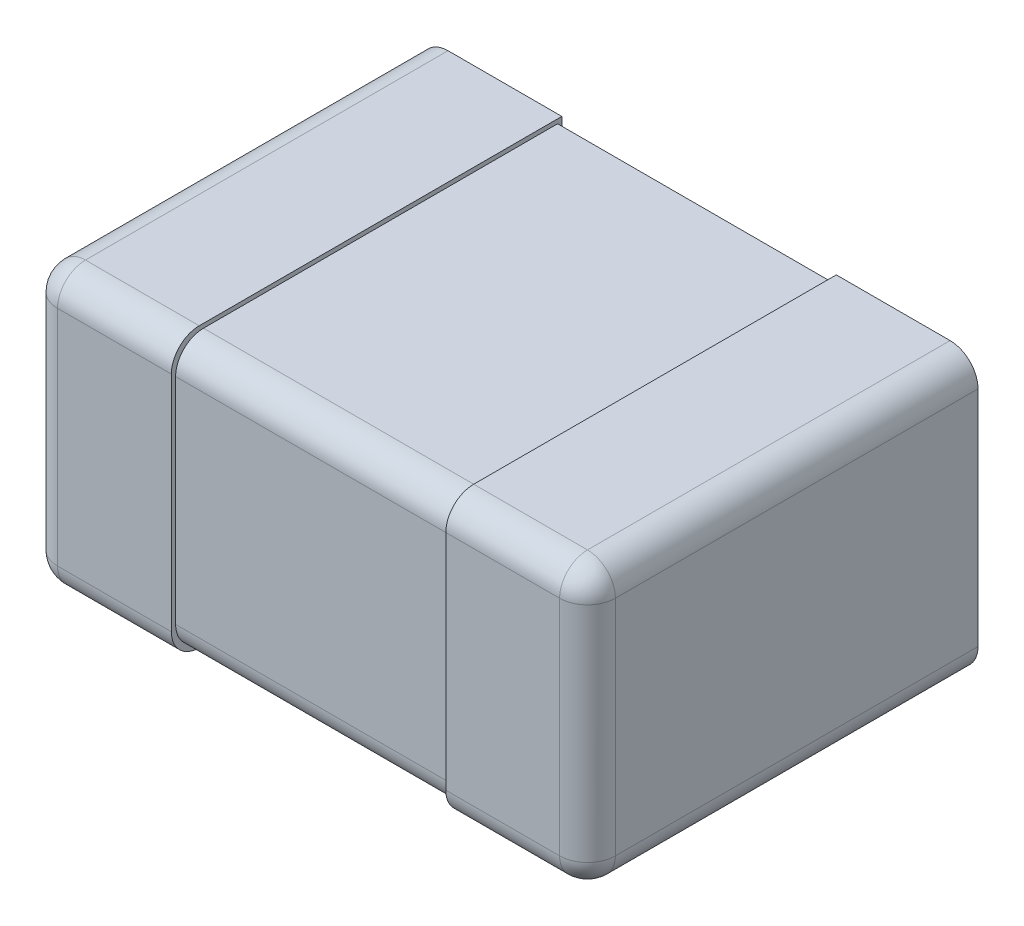
ISO-10303-21;
HEADER;
FILE_DESCRIPTION(('STEP AP214'),'2;1');
FILE_NAME('part.step','',(''),(''),'','','');
FILE_SCHEMA(('AUTOMOTIVE_DESIGN { 1 0 10303 214 1 1 1 1 }'));
ENDSEC;
DATA;
#1=APPLICATION_CONTEXT('core data for automotive mechanical design processes');
#2=APPLICATION_PROTOCOL_DEFINITION('international standard','automotive_design',2000,#1);
#3=PRODUCT_CONTEXT('',#1,'mechanical');
#4=PRODUCT('Part','Part','',(#3));
#5=PRODUCT_RELATED_PRODUCT_CATEGORY('part','',(#4));
#6=PRODUCT_DEFINITION_FORMATION('','',#4);
#7=PRODUCT_DEFINITION_CONTEXT('part definition',#1,'design');
#8=PRODUCT_DEFINITION('design','',#6,#7);
#9=PRODUCT_DEFINITION_SHAPE('','',#8);
#10=(LENGTH_UNIT() NAMED_UNIT(*) SI_UNIT(.MILLI.,.METRE.));
#11=(NAMED_UNIT(*) PLANE_ANGLE_UNIT() SI_UNIT($,.RADIAN.));
#12=(NAMED_UNIT(*) SI_UNIT($,.STERADIAN.) SOLID_ANGLE_UNIT());
#13=UNCERTAINTY_MEASURE_WITH_UNIT(LENGTH_MEASURE(1.E-05),#10,'distance_accuracy_value','');
#14=(GEOMETRIC_REPRESENTATION_CONTEXT(3) GLOBAL_UNCERTAINTY_ASSIGNED_CONTEXT((#13)) GLOBAL_UNIT_ASSIGNED_CONTEXT((#10,
#11,#12)) REPRESENTATION_CONTEXT('',''));
#15=CARTESIAN_POINT('',(0.,0.,0.));
#16=DIRECTION('',(0.,0.,1.));
#17=DIRECTION('',(1.,0.,0.));
#18=AXIS2_PLACEMENT_3D('',#15,#16,#17);
#19=CARTESIAN_POINT('',(-0.45,0.2,0.7262));
#20=DIRECTION('',(-0.707106781186548,0.,0.707106781186548));
#21=DIRECTION('',(0.,1.,0.));
#22=AXIS2_PLACEMENT_3D('',#19,#20,#21);
#23=SPHERICAL_SURFACE('',#22,0.05);
#24=CARTESIAN_POINT('',(-0.45,0.2,0.7262));
#25=DIRECTION('',(-1.,0.,0.));
#26=DIRECTION('',(0.,0.,1.));
#27=AXIS2_PLACEMENT_3D('',#24,#25,#26);
#28=CIRCLE('',#27,0.05);
#29=CARTESIAN_POINT('',(-0.45,0.25,0.7262));
#30=VERTEX_POINT('',#29);
#31=CARTESIAN_POINT('',(-0.45,0.2,0.7762));
#32=VERTEX_POINT('',#31);
#33=EDGE_CURVE('E58',#30,#32,#28,.F.);
#34=ORIENTED_EDGE('',*,*,#33,.F.);
#35=CARTESIAN_POINT('',(-0.45,0.2,0.7262));
#36=DIRECTION('',(0.,0.,-1.));
#37=DIRECTION('',(-1.,0.,0.));
#38=AXIS2_PLACEMENT_3D('',#35,#36,#37);
#39=CIRCLE('',#38,0.05);
#40=CARTESIAN_POINT('',(-0.5,0.2,0.7262));
#41=VERTEX_POINT('',#40);
#42=EDGE_CURVE('E21',#41,#30,#39,.T.);
#43=ORIENTED_EDGE('',*,*,#42,.F.);
#44=CARTESIAN_POINT('',(-0.45,0.2,0.7262));
#45=DIRECTION('',(0.,-1.,0.));
#46=DIRECTION('',(0.,0.,-1.));
#47=AXIS2_PLACEMENT_3D('',#44,#45,#46);
#48=CIRCLE('',#47,0.05);
#49=CARTESIAN_POINT('',(-0.485355339059327,0.2,0.761555339059327));
#50=VERTEX_POINT('',#49);
#51=EDGE_CURVE('E56',#50,#41,#48,.T.);
#52=ORIENTED_EDGE('',*,*,#51,.F.);
#53=CARTESIAN_POINT('',(-0.45,0.2,0.7262));
#54=DIRECTION('',(0.,-1.,0.));
#55=DIRECTION('',(0.,0.,-1.));
#56=AXIS2_PLACEMENT_3D('',#53,#54,#55);
#57=CIRCLE('',#56,0.05);
#58=EDGE_CURVE('E36',#32,#50,#57,.T.);
#59=ORIENTED_EDGE('',*,*,#58,.F.);
#60=EDGE_LOOP('',(#34,#43,#52,#59));
#61=FACE_BOUND('',#60,.T.);
#62=ADVANCED_FACE('F17',(#61),#23,.T.);
#63=CARTESIAN_POINT('',(-0.45,0.2,0.7785103169739));
#64=DIRECTION('',(0.,0.,-1.));
#65=DIRECTION('',(-1.,0.,0.));
#66=AXIS2_PLACEMENT_3D('',#63,#64,#65);
#67=CYLINDRICAL_SURFACE('',#66,0.05);
#68=ORIENTED_EDGE('',*,*,#42,.T.);
#69=DIRECTION('',(0.,0.,1.));
#70=VECTOR('',#69,1.);
#71=CARTESIAN_POINT('',(-0.45,0.25,0.0762));
#72=LINE('',#71,#70);
#73=CARTESIAN_POINT('',(-0.45,0.25,0.0762));
#74=VERTEX_POINT('',#73);
#75=EDGE_CURVE('E160',#74,#30,#72,.T.);
#76=ORIENTED_EDGE('',*,*,#75,.F.);
#77=CARTESIAN_POINT('',(-0.45,0.2,0.0762));
#78=DIRECTION('',(0.,0.,-1.));
#79=DIRECTION('',(-1.,0.,0.));
#80=AXIS2_PLACEMENT_3D('',#77,#78,#79);
#81=CIRCLE('',#80,0.05);
#82=CARTESIAN_POINT('',(-0.5,0.2,0.0762));
#83=VERTEX_POINT('',#82);
#84=EDGE_CURVE('E77',#74,#83,#81,.F.);
#85=ORIENTED_EDGE('',*,*,#84,.T.);
#86=DIRECTION('',(0.,0.,1.));
#87=VECTOR('',#86,1.);
#88=CARTESIAN_POINT('',(-0.5,0.2,0.0762));
#89=LINE('',#88,#87);
#90=EDGE_CURVE('E64',#41,#83,#89,.F.);
#91=ORIENTED_EDGE('',*,*,#90,.F.);
#92=EDGE_LOOP('',(#68,#76,#85,#91));
#93=FACE_BOUND('',#92,.T.);
#94=ADVANCED_FACE('F74',(#93),#67,.T.);
#95=CARTESIAN_POINT('',(-0.5,0.25,0.0762));
#96=DIRECTION('',(-1.,0.,0.));
#97=DIRECTION('',(0.,0.,1.));
#98=AXIS2_PLACEMENT_3D('',#95,#96,#97);
#99=PLANE('',#98);
#100=DIRECTION('',(0.,1.,0.));
#101=VECTOR('',#100,1.);
#102=CARTESIAN_POINT('',(-0.5,0.,0.0762));
#103=LINE('',#102,#101);
#104=CARTESIAN_POINT('',(-0.5,-0.2,0.0762));
#105=VERTEX_POINT('',#104);
#106=EDGE_CURVE('E153',#83,#105,#103,.F.);
#107=ORIENTED_EDGE('',*,*,#106,.T.);
#108=DIRECTION('',(0.,0.,-1.));
#109=VECTOR('',#108,1.);
#110=CARTESIAN_POINT('',(-0.5,-0.2,0.7785103169739));
#111=LINE('',#110,#109);
#112=CARTESIAN_POINT('',(-0.5,-0.2,0.7262));
#113=VERTEX_POINT('',#112);
#114=EDGE_CURVE('E81',#113,#105,#111,.T.);
#115=ORIENTED_EDGE('',*,*,#114,.F.);
#116=DIRECTION('',(0.,-1.,0.));
#117=VECTOR('',#116,1.);
#118=CARTESIAN_POINT('',(-0.5,0.2522702762042,0.7262));
#119=LINE('',#118,#117);
#120=EDGE_CURVE('E69',#41,#113,#119,.T.);
#121=ORIENTED_EDGE('',*,*,#120,.F.);
#122=ORIENTED_EDGE('',*,*,#90,.T.);
#123=EDGE_LOOP('',(#107,#115,#121,#122));
#124=FACE_BOUND('',#123,.T.);
#125=ADVANCED_FACE('F83',(#124),#99,.T.);
#126=CARTESIAN_POINT('',(-0.45,-0.2,0.7785103169739));
#127=DIRECTION('',(0.,0.,-1.));
#128=DIRECTION('',(-1.,0.,0.));
#129=AXIS2_PLACEMENT_3D('',#126,#127,#128);
#130=CYLINDRICAL_SURFACE('',#129,0.05);
#131=CARTESIAN_POINT('',(-0.45,-0.2,0.7262));
#132=DIRECTION('',(0.,0.,-1.));
#133=DIRECTION('',(-1.,0.,0.));
#134=AXIS2_PLACEMENT_3D('',#131,#132,#133);
#135=CIRCLE('',#134,0.05);
#136=CARTESIAN_POINT('',(-0.485355339059327,-0.235355339059327,0.7262));
#137=VERTEX_POINT('',#136);
#138=EDGE_CURVE('E174',#113,#137,#135,.F.);
#139=ORIENTED_EDGE('',*,*,#138,.F.);
#140=ORIENTED_EDGE('',*,*,#114,.T.);
#141=CARTESIAN_POINT('',(-0.45,-0.2,0.0762));
#142=DIRECTION('',(0.,0.,-1.));
#143=DIRECTION('',(-1.,0.,0.));
#144=AXIS2_PLACEMENT_3D('',#141,#142,#143);
#145=CIRCLE('',#144,0.05);
#146=CARTESIAN_POINT('',(-0.45,-0.25,0.0762));
#147=VERTEX_POINT('',#146);
#148=EDGE_CURVE('E155',#105,#147,#145,.F.);
#149=ORIENTED_EDGE('',*,*,#148,.T.);
#150=DIRECTION('',(0.,0.,-1.));
#151=VECTOR('',#150,1.);
#152=CARTESIAN_POINT('',(-0.45,-0.25,0.0762));
#153=LINE('',#152,#151);
#154=CARTESIAN_POINT('',(-0.45,-0.25,0.726200000000002));
#155=VERTEX_POINT('',#154);
#156=EDGE_CURVE('E190',#155,#147,#153,.T.);
#157=ORIENTED_EDGE('',*,*,#156,.F.);
#158=CARTESIAN_POINT('',(-0.45,-0.2,0.7262));
#159=DIRECTION('',(0.,0.,1.));
#160=DIRECTION('',(-0.707106781186547,-0.707106781186547,0.));
#161=AXIS2_PLACEMENT_3D('',#158,#159,#160);
#162=CIRCLE('',#161,0.05);
#163=EDGE_CURVE('E175',#137,#155,#162,.T.);
#164=ORIENTED_EDGE('',*,*,#163,.F.);
#165=EDGE_LOOP('',(#139,#140,#149,#157,#164));
#166=FACE_BOUND('',#165,.T.);
#167=ADVANCED_FACE('F197',(#166),#130,.T.);
#168=CARTESIAN_POINT('',(-0.45,-0.2,0.7262));
#169=DIRECTION('',(-0.707106781186548,-0.707106781186548,0.));
#170=DIRECTION('',(0.,0.,1.));
#171=AXIS2_PLACEMENT_3D('',#168,#169,#170);
#172=SPHERICAL_SURFACE('',#171,0.05);
#173=CARTESIAN_POINT('',(-0.45,-0.2,0.7262));
#174=DIRECTION('',(1.,0.,0.));
#175=DIRECTION('',(0.,0.,-1.));
#176=AXIS2_PLACEMENT_3D('',#173,#174,#175);
#177=CIRCLE('',#176,0.05);
#178=CARTESIAN_POINT('',(-0.45,-0.2,0.7762));
#179=VERTEX_POINT('',#178);
#180=EDGE_CURVE('E147',#179,#155,#177,.T.);
#181=ORIENTED_EDGE('',*,*,#180,.F.);
#182=CARTESIAN_POINT('',(-0.45,-0.2,0.7262));
#183=DIRECTION('',(0.,-1.,0.));
#184=DIRECTION('',(0.,0.,-1.));
#185=AXIS2_PLACEMENT_3D('',#182,#183,#184);
#186=CIRCLE('',#185,0.05);
#187=EDGE_CURVE('E85',#113,#179,#186,.F.);
#188=ORIENTED_EDGE('',*,*,#187,.F.);
#189=ORIENTED_EDGE('',*,*,#138,.T.);
#190=ORIENTED_EDGE('',*,*,#163,.T.);
#191=EDGE_LOOP('',(#181,#188,#189,#190));
#192=FACE_BOUND('',#191,.T.);
#193=ADVANCED_FACE('F193',(#192),#172,.T.);
#194=CARTESIAN_POINT('',(-0.45,0.2522702762042,0.7262));
#195=DIRECTION('',(0.,-1.,0.));
#196=DIRECTION('',(0.,0.,-1.));
#197=AXIS2_PLACEMENT_3D('',#194,#195,#196);
#198=CYLINDRICAL_SURFACE('',#197,0.05);
#199=ORIENTED_EDGE('',*,*,#187,.T.);
#200=DIRECTION('',(0.,1.,0.));
#201=VECTOR('',#200,1.);
#202=CARTESIAN_POINT('',(-0.45,0.,0.7762));
#203=LINE('',#202,#201);
#204=EDGE_CURVE('E317',#32,#179,#203,.F.);
#205=ORIENTED_EDGE('',*,*,#204,.F.);
#206=ORIENTED_EDGE('',*,*,#58,.T.);
#207=ORIENTED_EDGE('',*,*,#51,.T.);
#208=ORIENTED_EDGE('',*,*,#120,.T.);
#209=EDGE_LOOP('',(#199,#205,#206,#207,#208));
#210=FACE_BOUND('',#209,.T.);
#211=ADVANCED_FACE('F67',(#210),#198,.T.);
#212=CARTESIAN_POINT('',(0.45,0.2,0.7262));
#213=DIRECTION('',(0.,0.707106781186548,0.707106781186548));
#214=DIRECTION('',(1.,0.,0.));
#215=AXIS2_PLACEMENT_3D('',#212,#213,#214);
#216=SPHERICAL_SURFACE('',#215,0.05);
#217=CARTESIAN_POINT('',(0.45,0.2,0.7262));
#218=DIRECTION('',(-1.,0.,0.));
#219=DIRECTION('',(0.,0.,1.));
#220=AXIS2_PLACEMENT_3D('',#217,#218,#219);
#221=CIRCLE('',#220,0.05);
#222=CARTESIAN_POINT('',(0.45,0.2,0.7762));
#223=VERTEX_POINT('',#222);
#224=CARTESIAN_POINT('',(0.45,0.235355339059327,0.761555339059327));
#225=VERTEX_POINT('',#224);
#226=EDGE_CURVE('E146',#223,#225,#221,.T.);
#227=ORIENTED_EDGE('',*,*,#226,.F.);
#228=CARTESIAN_POINT('',(0.45,0.2,0.7262));
#229=DIRECTION('',(0.,1.,0.));
#230=DIRECTION('',(0.,0.,1.));
#231=AXIS2_PLACEMENT_3D('',#228,#229,#230);
#232=CIRCLE('',#231,0.05);
#233=CARTESIAN_POINT('',(0.5,0.2,0.7262));
#234=VERTEX_POINT('',#233);
#235=EDGE_CURVE('E87',#234,#223,#232,.F.);
#236=ORIENTED_EDGE('',*,*,#235,.F.);
#237=CARTESIAN_POINT('',(0.45,0.2,0.7262));
#238=DIRECTION('',(0.,0.,-1.));
#239=DIRECTION('',(-1.,0.,0.));
#240=AXIS2_PLACEMENT_3D('',#237,#238,#239);
#241=CIRCLE('',#240,0.05);
#242=CARTESIAN_POINT('',(0.45,0.25,0.7262));
#243=VERTEX_POINT('',#242);
#244=EDGE_CURVE('E162',#243,#234,#241,.T.);
#245=ORIENTED_EDGE('',*,*,#244,.F.);
#246=CARTESIAN_POINT('',(0.45,0.2,0.7262));
#247=DIRECTION('',(-1.,0.,0.));
#248=DIRECTION('',(0.,0.,1.));
#249=AXIS2_PLACEMENT_3D('',#246,#247,#248);
#250=CIRCLE('',#249,0.05);
#251=EDGE_CURVE('E142',#225,#243,#250,.T.);
#252=ORIENTED_EDGE('',*,*,#251,.F.);
#253=EDGE_LOOP('',(#227,#236,#245,#252));
#254=FACE_BOUND('',#253,.T.);
#255=ADVANCED_FACE('F318',(#254),#216,.T.);
#256=CARTESIAN_POINT('',(0.45,-0.2522265148321,0.7262));
#257=DIRECTION('',(0.,1.,0.));
#258=DIRECTION('',(0.,0.,1.));
#259=AXIS2_PLACEMENT_3D('',#256,#257,#258);
#260=CYLINDRICAL_SURFACE('',#259,0.05);
#261=CARTESIAN_POINT('',(0.45,-0.2,0.7262));
#262=DIRECTION('',(0.,1.,0.));
#263=DIRECTION('',(0.,0.,1.));
#264=AXIS2_PLACEMENT_3D('',#261,#262,#263);
#265=CIRCLE('',#264,0.05);
#266=CARTESIAN_POINT('',(0.5,-0.2,0.7262));
#267=VERTEX_POINT('',#266);
#268=CARTESIAN_POINT('',(0.485355339059327,-0.2,0.761555339059327));
#269=VERTEX_POINT('',#268);
#270=EDGE_CURVE('E170',#267,#269,#265,.F.);
#271=ORIENTED_EDGE('',*,*,#270,.F.);
#272=DIRECTION('',(0.,1.,0.));
#273=VECTOR('',#272,1.);
#274=CARTESIAN_POINT('',(0.5,-0.25,0.7262));
#275=LINE('',#274,#273);
#276=EDGE_CURVE('E91',#234,#267,#275,.F.);
#277=ORIENTED_EDGE('',*,*,#276,.F.);
#278=ORIENTED_EDGE('',*,*,#235,.T.);
#279=DIRECTION('',(0.,1.,0.));
#280=VECTOR('',#279,1.);
#281=CARTESIAN_POINT('',(0.45,0.,0.7762));
#282=LINE('',#281,#280);
#283=CARTESIAN_POINT('',(0.45,-0.2,0.7762));
#284=VERTEX_POINT('',#283);
#285=EDGE_CURVE('E141',#284,#223,#282,.T.);
#286=ORIENTED_EDGE('',*,*,#285,.F.);
#287=CARTESIAN_POINT('',(0.45,-0.2,0.7262));
#288=DIRECTION('',(0.,-1.,0.));
#289=DIRECTION('',(0.707106781186548,0.,0.707106781186548));
#290=AXIS2_PLACEMENT_3D('',#287,#288,#289);
#291=CIRCLE('',#290,0.05);
#292=EDGE_CURVE('E169',#269,#284,#291,.T.);
#293=ORIENTED_EDGE('',*,*,#292,.F.);
#294=EDGE_LOOP('',(#271,#277,#278,#286,#293));
#295=FACE_BOUND('',#294,.T.);
#296=ADVANCED_FACE('F307',(#295),#260,.T.);
#297=CARTESIAN_POINT('',(0.45,-0.2,0.7262));
#298=DIRECTION('',(0.707106781186548,0.,0.707106781186548));
#299=DIRECTION('',(0.,-1.,0.));
#300=AXIS2_PLACEMENT_3D('',#297,#298,#299);
#301=SPHERICAL_SURFACE('',#300,0.05);
#302=CARTESIAN_POINT('',(0.45,-0.2,0.7262));
#303=DIRECTION('',(1.,0.,0.));
#304=DIRECTION('',(0.,0.,-1.));
#305=AXIS2_PLACEMENT_3D('',#302,#303,#304);
#306=CIRCLE('',#305,0.05);
#307=CARTESIAN_POINT('',(0.45,-0.25,0.7262));
#308=VERTEX_POINT('',#307);
#309=EDGE_CURVE('E137',#308,#284,#306,.F.);
#310=ORIENTED_EDGE('',*,*,#309,.F.);
#311=CARTESIAN_POINT('',(0.45,-0.2,0.7262));
#312=DIRECTION('',(0.,0.,-1.));
#313=DIRECTION('',(-1.,0.,0.));
#314=AXIS2_PLACEMENT_3D('',#311,#312,#313);
#315=CIRCLE('',#314,0.05);
#316=EDGE_CURVE('E166',#267,#308,#315,.T.);
#317=ORIENTED_EDGE('',*,*,#316,.F.);
#318=ORIENTED_EDGE('',*,*,#270,.T.);
#319=ORIENTED_EDGE('',*,*,#292,.T.);
#320=EDGE_LOOP('',(#310,#317,#318,#319));
#321=FACE_BOUND('',#320,.T.);
#322=ADVANCED_FACE('F302',(#321),#301,.T.);
#323=CARTESIAN_POINT('',(0.45,-0.2,0.7785103169739));
#324=DIRECTION('',(0.,0.,-1.));
#325=DIRECTION('',(-1.,0.,0.));
#326=AXIS2_PLACEMENT_3D('',#323,#324,#325);
#327=CYLINDRICAL_SURFACE('',#326,0.05);
#328=ORIENTED_EDGE('',*,*,#316,.T.);
#329=DIRECTION('',(0.,0.,-1.));
#330=VECTOR('',#329,1.);
#331=CARTESIAN_POINT('',(0.45,-0.25,0.0762));
#332=LINE('',#331,#330);
#333=CARTESIAN_POINT('',(0.45,-0.25,0.0762));
#334=VERTEX_POINT('',#333);
#335=EDGE_CURVE('E136',#334,#308,#332,.F.);
#336=ORIENTED_EDGE('',*,*,#335,.F.);
#337=CARTESIAN_POINT('',(0.45,-0.2,0.0762));
#338=DIRECTION('',(0.,0.,-1.));
#339=DIRECTION('',(-1.,0.,0.));
#340=AXIS2_PLACEMENT_3D('',#337,#338,#339);
#341=CIRCLE('',#340,0.05);
#342=CARTESIAN_POINT('',(0.5,-0.2,0.0762));
#343=VERTEX_POINT('',#342);
#344=EDGE_CURVE('E128',#334,#343,#341,.F.);
#345=ORIENTED_EDGE('',*,*,#344,.T.);
#346=DIRECTION('',(0.,0.,-1.));
#347=VECTOR('',#346,1.);
#348=CARTESIAN_POINT('',(0.5,-0.2,0.0762));
#349=LINE('',#348,#347);
#350=EDGE_CURVE('E165',#267,#343,#349,.T.);
#351=ORIENTED_EDGE('',*,*,#350,.F.);
#352=EDGE_LOOP('',(#328,#336,#345,#351));
#353=FACE_BOUND('',#352,.T.);
#354=ADVANCED_FACE('F298',(#353),#327,.T.);
#355=CARTESIAN_POINT('',(0.5,-0.25,0.0762));
#356=DIRECTION('',(1.,0.,0.));
#357=DIRECTION('',(0.,0.,-1.));
#358=AXIS2_PLACEMENT_3D('',#355,#356,#357);
#359=PLANE('',#358);
#360=DIRECTION('',(0.,1.,0.));
#361=VECTOR('',#360,1.);
#362=CARTESIAN_POINT('',(0.5,0.,0.0762));
#363=LINE('',#362,#361);
#364=CARTESIAN_POINT('',(0.5,0.2,0.0762));
#365=VERTEX_POINT('',#364);
#366=EDGE_CURVE('E131',#343,#365,#363,.T.);
#367=ORIENTED_EDGE('',*,*,#366,.T.);
#368=DIRECTION('',(0.,0.,-1.));
#369=VECTOR('',#368,1.);
#370=CARTESIAN_POINT('',(0.5,0.2,0.7785103169739));
#371=LINE('',#370,#369);
#372=EDGE_CURVE('E161',#234,#365,#371,.T.);
#373=ORIENTED_EDGE('',*,*,#372,.F.);
#374=ORIENTED_EDGE('',*,*,#276,.T.);
#375=ORIENTED_EDGE('',*,*,#350,.T.);
#376=EDGE_LOOP('',(#367,#373,#374,#375));
#377=FACE_BOUND('',#376,.T.);
#378=ADVANCED_FACE('F294',(#377),#359,.T.);
#379=CARTESIAN_POINT('',(0.45,0.2,0.7785103169739));
#380=DIRECTION('',(0.,0.,-1.));
#381=DIRECTION('',(-1.,0.,0.));
#382=AXIS2_PLACEMENT_3D('',#379,#380,#381);
#383=CYLINDRICAL_SURFACE('',#382,0.05);
#384=ORIENTED_EDGE('',*,*,#244,.T.);
#385=ORIENTED_EDGE('',*,*,#372,.T.);
#386=CARTESIAN_POINT('',(0.45,0.2,0.0762));
#387=DIRECTION('',(0.,0.,-1.));
#388=DIRECTION('',(-1.,0.,0.));
#389=AXIS2_PLACEMENT_3D('',#386,#387,#388);
#390=CIRCLE('',#389,0.05);
#391=CARTESIAN_POINT('',(0.45,0.25,0.0762));
#392=VERTEX_POINT('',#391);
#393=EDGE_CURVE('E133',#365,#392,#390,.F.);
#394=ORIENTED_EDGE('',*,*,#393,.T.);
#395=DIRECTION('',(0.,0.,1.));
#396=VECTOR('',#395,1.);
#397=CARTESIAN_POINT('',(0.45,0.25,0.0762));
#398=LINE('',#397,#396);
#399=EDGE_CURVE('E374',#243,#392,#398,.F.);
#400=ORIENTED_EDGE('',*,*,#399,.F.);
#401=EDGE_LOOP('',(#384,#385,#394,#400));
#402=FACE_BOUND('',#401,.T.);
#403=ADVANCED_FACE('F290',(#402),#383,.T.);
#404=CARTESIAN_POINT('',(0.5021829306315,0.2,0.7262));
#405=DIRECTION('',(-1.,0.,0.));
#406=DIRECTION('',(0.,0.,1.));
#407=AXIS2_PLACEMENT_3D('',#404,#405,#406);
#408=CYLINDRICAL_SURFACE('',#407,0.05);
#409=CARTESIAN_POINT('',(-0.246,0.2,0.7262));
#410=DIRECTION('',(-1.,0.,0.));
#411=DIRECTION('',(0.,0.,1.));
#412=AXIS2_PLACEMENT_3D('',#409,#410,#411);
#413=CIRCLE('',#412,0.05);
#414=CARTESIAN_POINT('',(-0.246,0.2,0.7762));
#415=VERTEX_POINT('',#414);
#416=CARTESIAN_POINT('',(-0.246,0.25,0.7262));
#417=VERTEX_POINT('',#416);
#418=EDGE_CURVE('E123',#415,#417,#413,.T.);
#419=ORIENTED_EDGE('',*,*,#418,.T.);
#420=DIRECTION('',(1.,0.,0.));
#421=VECTOR('',#420,1.);
#422=CARTESIAN_POINT('',(0.5,0.25,0.7262));
#423=LINE('',#422,#421);
#424=EDGE_CURVE('E158',#30,#417,#423,.T.);
#425=ORIENTED_EDGE('',*,*,#424,.F.);
#426=ORIENTED_EDGE('',*,*,#33,.T.);
#427=DIRECTION('',(1.,0.,0.));
#428=VECTOR('',#427,1.);
#429=CARTESIAN_POINT('',(0.,0.2,0.7762));
#430=LINE('',#429,#428);
#431=EDGE_CURVE('E335',#415,#32,#430,.F.);
#432=ORIENTED_EDGE('',*,*,#431,.F.);
#433=EDGE_LOOP('',(#419,#425,#426,#432));
#434=FACE_BOUND('',#433,.T.);
#435=ADVANCED_FACE('F286',(#434),#408,.T.);
#436=CARTESIAN_POINT('',(0.5,0.25,0.0762));
#437=DIRECTION('',(0.,1.,0.));
#438=DIRECTION('',(0.,0.,1.));
#439=AXIS2_PLACEMENT_3D('',#436,#437,#438);
#440=PLANE('',#439);
#441=ORIENTED_EDGE('',*,*,#75,.T.);
#442=ORIENTED_EDGE('',*,*,#424,.T.);
#443=DIRECTION('',(0.,0.,1.));
#444=VECTOR('',#443,1.);
#445=CARTESIAN_POINT('',(-0.246,0.25,0.0762));
#446=LINE('',#445,#444);
#447=CARTESIAN_POINT('',(-0.246,0.25,0.0762));
#448=VERTEX_POINT('',#447);
#449=EDGE_CURVE('E126',#417,#448,#446,.F.);
#450=ORIENTED_EDGE('',*,*,#449,.T.);
#451=DIRECTION('',(1.,0.,0.));
#452=VECTOR('',#451,1.);
#453=CARTESIAN_POINT('',(0.,0.25,0.0762));
#454=LINE('',#453,#452);
#455=EDGE_CURVE('E154',#448,#74,#454,.F.);
#456=ORIENTED_EDGE('',*,*,#455,.T.);
#457=EDGE_LOOP('',(#441,#442,#450,#456));
#458=FACE_BOUND('',#457,.T.);
#459=ADVANCED_FACE('F282',(#458),#440,.T.);
#460=CARTESIAN_POINT('',(0.,0.,0.0762));
#461=DIRECTION('',(0.,0.,1.));
#462=DIRECTION('',(1.,0.,0.));
#463=AXIS2_PLACEMENT_3D('',#460,#461,#462);
#464=PLANE('',#463);
#465=ORIENTED_EDGE('',*,*,#84,.F.);
#466=ORIENTED_EDGE('',*,*,#455,.F.);
#467=DIRECTION('',(0.,1.,0.));
#468=VECTOR('',#467,1.);
#469=CARTESIAN_POINT('',(-0.246,-0.25,0.0762));
#470=LINE('',#469,#468);
#471=CARTESIAN_POINT('',(-0.246,-0.25,0.0762));
#472=VERTEX_POINT('',#471);
#473=EDGE_CURVE('E362',#448,#472,#470,.F.);
#474=ORIENTED_EDGE('',*,*,#473,.T.);
#475=DIRECTION('',(1.,0.,0.));
#476=VECTOR('',#475,1.);
#477=CARTESIAN_POINT('',(-0.5,-0.25,0.0762));
#478=LINE('',#477,#476);
#479=EDGE_CURVE('E151',#147,#472,#478,.T.);
#480=ORIENTED_EDGE('',*,*,#479,.F.);
#481=ORIENTED_EDGE('',*,*,#148,.F.);
#482=ORIENTED_EDGE('',*,*,#106,.F.);
#483=EDGE_LOOP('',(#465,#466,#474,#480,#481,#482));
#484=FACE_BOUND('',#483,.T.);
#485=ADVANCED_FACE('F278',(#484),#464,.F.);
#486=CARTESIAN_POINT('',(-0.5,-0.25,0.0762));
#487=DIRECTION('',(0.,-1.,0.));
#488=DIRECTION('',(0.,0.,-1.));
#489=AXIS2_PLACEMENT_3D('',#486,#487,#488);
#490=PLANE('',#489);
#491=DIRECTION('',(0.,0.,1.));
#492=VECTOR('',#491,1.);
#493=CARTESIAN_POINT('',(-0.246,-0.25,0.0762));
#494=LINE('',#493,#492);
#495=CARTESIAN_POINT('',(-0.246,-0.25,0.7262));
#496=VERTEX_POINT('',#495);
#497=EDGE_CURVE('E122',#472,#496,#494,.T.);
#498=ORIENTED_EDGE('',*,*,#497,.T.);
#499=DIRECTION('',(1.,0.,0.));
#500=VECTOR('',#499,1.);
#501=CARTESIAN_POINT('',(-0.5022702762042,-0.25,0.7262));
#502=LINE('',#501,#500);
#503=EDGE_CURVE('E150',#155,#496,#502,.T.);
#504=ORIENTED_EDGE('',*,*,#503,.F.);
#505=ORIENTED_EDGE('',*,*,#156,.T.);
#506=ORIENTED_EDGE('',*,*,#479,.T.);
#507=EDGE_LOOP('',(#498,#504,#505,#506));
#508=FACE_BOUND('',#507,.T.);
#509=ADVANCED_FACE('F274',(#508),#490,.T.);
#510=CARTESIAN_POINT('',(-0.5022702762042,-0.2,0.7262));
#511=DIRECTION('',(1.,0.,0.));
#512=DIRECTION('',(0.,0.,-1.));
#513=AXIS2_PLACEMENT_3D('',#510,#511,#512);
#514=CYLINDRICAL_SURFACE('',#513,0.05);
#515=ORIENTED_EDGE('',*,*,#180,.T.);
#516=ORIENTED_EDGE('',*,*,#503,.T.);
#517=CARTESIAN_POINT('',(-0.246,-0.2,0.7262));
#518=DIRECTION('',(1.,0.,0.));
#519=DIRECTION('',(0.,0.,-1.));
#520=AXIS2_PLACEMENT_3D('',#517,#518,#519);
#521=CIRCLE('',#520,0.05);
#522=CARTESIAN_POINT('',(-0.246,-0.2,0.7762));
#523=VERTEX_POINT('',#522);
#524=EDGE_CURVE('E118',#496,#523,#521,.F.);
#525=ORIENTED_EDGE('',*,*,#524,.T.);
#526=DIRECTION('',(1.,0.,0.));
#527=VECTOR('',#526,1.);
#528=CARTESIAN_POINT('',(0.,-0.2,0.7762));
#529=LINE('',#528,#527);
#530=EDGE_CURVE('E351',#179,#523,#529,.T.);
#531=ORIENTED_EDGE('',*,*,#530,.F.);
#532=EDGE_LOOP('',(#515,#516,#525,#531));
#533=FACE_BOUND('',#532,.T.);
#534=ADVANCED_FACE('F270',(#533),#514,.T.);
#535=CARTESIAN_POINT('',(0.,0.,0.7762));
#536=DIRECTION('',(0.,0.,1.));
#537=DIRECTION('',(1.,0.,0.));
#538=AXIS2_PLACEMENT_3D('',#535,#536,#537);
#539=PLANE('',#538);
#540=DIRECTION('',(0.,1.,0.));
#541=VECTOR('',#540,1.);
#542=CARTESIAN_POINT('',(-0.246,-0.25,0.7762));
#543=LINE('',#542,#541);
#544=EDGE_CURVE('E121',#523,#415,#543,.T.);
#545=ORIENTED_EDGE('',*,*,#544,.T.);
#546=ORIENTED_EDGE('',*,*,#431,.T.);
#547=ORIENTED_EDGE('',*,*,#204,.T.);
#548=ORIENTED_EDGE('',*,*,#530,.T.);
#549=EDGE_LOOP('',(#545,#546,#547,#548));
#550=FACE_BOUND('',#549,.T.);
#551=ADVANCED_FACE('F266',(#550),#539,.T.);
#552=CARTESIAN_POINT('',(0.5021829306315,0.2,0.7262));
#553=DIRECTION('',(-1.,0.,0.));
#554=DIRECTION('',(0.,0.,1.));
#555=AXIS2_PLACEMENT_3D('',#552,#553,#554);
#556=CYLINDRICAL_SURFACE('',#555,0.05);
#557=DIRECTION('',(1.,0.,0.));
#558=VECTOR('',#557,1.);
#559=CARTESIAN_POINT('',(0.5,0.25,0.7262));
#560=LINE('',#559,#558);
#561=CARTESIAN_POINT('',(0.246,0.25,0.7262));
#562=VERTEX_POINT('',#561);
#563=EDGE_CURVE('E378',#562,#243,#560,.T.);
#564=ORIENTED_EDGE('',*,*,#563,.F.);
#565=CARTESIAN_POINT('',(0.246,0.2,0.7262));
#566=DIRECTION('',(-1.,0.,0.));
#567=DIRECTION('',(0.,0.,1.));
#568=AXIS2_PLACEMENT_3D('',#565,#566,#567);
#569=CIRCLE('',#568,0.05);
#570=CARTESIAN_POINT('',(0.246,0.2,0.7762));
#571=VERTEX_POINT('',#570);
#572=EDGE_CURVE('E109',#562,#571,#569,.F.);
#573=ORIENTED_EDGE('',*,*,#572,.T.);
#574=DIRECTION('',(1.,0.,0.));
#575=VECTOR('',#574,1.);
#576=CARTESIAN_POINT('',(0.,0.2,0.7762));
#577=LINE('',#576,#575);
#578=EDGE_CURVE('E145',#223,#571,#577,.F.);
#579=ORIENTED_EDGE('',*,*,#578,.F.);
#580=ORIENTED_EDGE('',*,*,#226,.T.);
#581=ORIENTED_EDGE('',*,*,#251,.T.);
#582=EDGE_LOOP('',(#564,#573,#579,#580,#581));
#583=FACE_BOUND('',#582,.T.);
#584=ADVANCED_FACE('F262',(#583),#556,.T.);
#585=CARTESIAN_POINT('',(0.,0.,0.7762));
#586=DIRECTION('',(0.,0.,1.));
#587=DIRECTION('',(1.,0.,0.));
#588=AXIS2_PLACEMENT_3D('',#585,#586,#587);
#589=PLANE('',#588);
#590=DIRECTION('',(1.,0.,0.));
#591=VECTOR('',#590,1.);
#592=CARTESIAN_POINT('',(-0.5022702762042,-0.2,0.7762));
#593=LINE('',#592,#591);
#594=CARTESIAN_POINT('',(0.246,-0.2,0.7762));
#595=VERTEX_POINT('',#594);
#596=EDGE_CURVE('E140',#284,#595,#593,.F.);
#597=ORIENTED_EDGE('',*,*,#596,.F.);
#598=ORIENTED_EDGE('',*,*,#285,.T.);
#599=ORIENTED_EDGE('',*,*,#578,.T.);
#600=DIRECTION('',(0.,1.,0.));
#601=VECTOR('',#600,1.);
#602=CARTESIAN_POINT('',(0.246,-0.25,0.7762));
#603=LINE('',#602,#601);
#604=EDGE_CURVE('E108',#571,#595,#603,.F.);
#605=ORIENTED_EDGE('',*,*,#604,.T.);
#606=EDGE_LOOP('',(#597,#598,#599,#605));
#607=FACE_BOUND('',#606,.T.);
#608=ADVANCED_FACE('F258',(#607),#589,.T.);
#609=CARTESIAN_POINT('',(-0.5022702762042,-0.2,0.7262));
#610=DIRECTION('',(1.,0.,0.));
#611=DIRECTION('',(0.,0.,-1.));
#612=AXIS2_PLACEMENT_3D('',#609,#610,#611);
#613=CYLINDRICAL_SURFACE('',#612,0.05);
#614=ORIENTED_EDGE('',*,*,#596,.T.);
#615=CARTESIAN_POINT('',(0.246,-0.2,0.7262));
#616=DIRECTION('',(1.,0.,0.));
#617=DIRECTION('',(0.,0.,-1.));
#618=AXIS2_PLACEMENT_3D('',#615,#616,#617);
#619=CIRCLE('',#618,0.05);
#620=CARTESIAN_POINT('',(0.246,-0.25,0.7262));
#621=VERTEX_POINT('',#620);
#622=EDGE_CURVE('E104',#595,#621,#619,.T.);
#623=ORIENTED_EDGE('',*,*,#622,.T.);
#624=DIRECTION('',(1.,0.,0.));
#625=VECTOR('',#624,1.);
#626=CARTESIAN_POINT('',(-0.5,-0.25,0.7262));
#627=LINE('',#626,#625);
#628=EDGE_CURVE('E382',#308,#621,#627,.F.);
#629=ORIENTED_EDGE('',*,*,#628,.F.);
#630=ORIENTED_EDGE('',*,*,#309,.T.);
#631=EDGE_LOOP('',(#614,#623,#629,#630));
#632=FACE_BOUND('',#631,.T.);
#633=ADVANCED_FACE('F254',(#632),#613,.T.);
#634=CARTESIAN_POINT('',(-0.5,-0.25,0.0762));
#635=DIRECTION('',(0.,-1.,0.));
#636=DIRECTION('',(0.,0.,-1.));
#637=AXIS2_PLACEMENT_3D('',#634,#635,#636);
#638=PLANE('',#637);
#639=DIRECTION('',(1.,0.,0.));
#640=VECTOR('',#639,1.);
#641=CARTESIAN_POINT('',(0.,-0.25,0.0762));
#642=LINE('',#641,#640);
#643=CARTESIAN_POINT('',(0.246,-0.25,0.0762));
#644=VERTEX_POINT('',#643);
#645=EDGE_CURVE('E132',#644,#334,#642,.T.);
#646=ORIENTED_EDGE('',*,*,#645,.T.);
#647=ORIENTED_EDGE('',*,*,#335,.T.);
#648=ORIENTED_EDGE('',*,*,#628,.T.);
#649=DIRECTION('',(0.,0.,-1.));
#650=VECTOR('',#649,1.);
#651=CARTESIAN_POINT('',(0.246,-0.25,0.08382));
#652=LINE('',#651,#650);
#653=EDGE_CURVE('E107',#621,#644,#652,.T.);
#654=ORIENTED_EDGE('',*,*,#653,.T.);
#655=EDGE_LOOP('',(#646,#647,#648,#654));
#656=FACE_BOUND('',#655,.T.);
#657=ADVANCED_FACE('F250',(#656),#638,.T.);
#658=CARTESIAN_POINT('',(0.,0.,0.0762));
#659=DIRECTION('',(0.,0.,1.));
#660=DIRECTION('',(1.,0.,0.));
#661=AXIS2_PLACEMENT_3D('',#658,#659,#660);
#662=PLANE('',#661);
#663=ORIENTED_EDGE('',*,*,#344,.F.);
#664=ORIENTED_EDGE('',*,*,#645,.F.);
#665=DIRECTION('',(0.,1.,0.));
#666=VECTOR('',#665,1.);
#667=CARTESIAN_POINT('',(0.246,-0.25,0.0762));
#668=LINE('',#667,#666);
#669=CARTESIAN_POINT('',(0.246,0.25,0.0762));
#670=VERTEX_POINT('',#669);
#671=EDGE_CURVE('E481',#644,#670,#668,.T.);
#672=ORIENTED_EDGE('',*,*,#671,.T.);
#673=DIRECTION('',(1.,0.,0.));
#674=VECTOR('',#673,1.);
#675=CARTESIAN_POINT('',(0.5,0.25,0.0762));
#676=LINE('',#675,#674);
#677=EDGE_CURVE('E401',#392,#670,#676,.F.);
#678=ORIENTED_EDGE('',*,*,#677,.F.);
#679=ORIENTED_EDGE('',*,*,#393,.F.);
#680=ORIENTED_EDGE('',*,*,#366,.F.);
#681=EDGE_LOOP('',(#663,#664,#672,#678,#679,#680));
#682=FACE_BOUND('',#681,.T.);
#683=ADVANCED_FACE('F246',(#682),#662,.F.);
#684=CARTESIAN_POINT('',(0.5,0.25,0.0762));
#685=DIRECTION('',(0.,1.,0.));
#686=DIRECTION('',(0.,0.,1.));
#687=AXIS2_PLACEMENT_3D('',#684,#685,#686);
#688=PLANE('',#687);
#689=ORIENTED_EDGE('',*,*,#563,.T.);
#690=ORIENTED_EDGE('',*,*,#399,.T.);
#691=ORIENTED_EDGE('',*,*,#677,.T.);
#692=DIRECTION('',(0.,0.,-1.));
#693=VECTOR('',#692,1.);
#694=CARTESIAN_POINT('',(0.246,0.25,0.08382));
#695=LINE('',#694,#693);
#696=EDGE_CURVE('E482',#670,#562,#695,.F.);
#697=ORIENTED_EDGE('',*,*,#696,.T.);
#698=EDGE_LOOP('',(#689,#690,#691,#697));
#699=FACE_BOUND('',#698,.T.);
#700=ADVANCED_FACE('F242',(#699),#688,.T.);
#701=CARTESIAN_POINT('',(-0.246,-0.24238,0.7762));
#702=DIRECTION('',(0.,1.,0.));
#703=DIRECTION('',(0.,0.,1.));
#704=AXIS2_PLACEMENT_3D('',#701,#702,#703);
#705=PLANE('',#704);
#706=DIRECTION('',(0.,0.,-1.));
#707=VECTOR('',#706,1.);
#708=CARTESIAN_POINT('',(0.246,-0.24238,0.08382));
#709=LINE('',#708,#707);
#710=CARTESIAN_POINT('',(0.246,-0.24238,0.08382));
#711=VERTEX_POINT('',#710);
#712=CARTESIAN_POINT('',(0.246,-0.24238,0.71858));
#713=VERTEX_POINT('',#712);
#714=EDGE_CURVE('E103',#711,#713,#709,.F.);
#715=ORIENTED_EDGE('',*,*,#714,.T.);
#716=DIRECTION('',(-1.,0.,0.));
#717=VECTOR('',#716,1.);
#718=CARTESIAN_POINT('',(0.2481829306315,-0.24238,0.71858));
#719=LINE('',#718,#717);
#720=CARTESIAN_POINT('',(-0.246,-0.24238,0.71858));
#721=VERTEX_POINT('',#720);
#722=EDGE_CURVE('E377',#721,#713,#719,.F.);
#723=ORIENTED_EDGE('',*,*,#722,.F.);
#724=DIRECTION('',(0.,0.,1.));
#725=VECTOR('',#724,1.);
#726=CARTESIAN_POINT('',(-0.246,-0.24238,0.0762));
#727=LINE('',#726,#725);
#728=CARTESIAN_POINT('',(-0.246,-0.24238,0.08382));
#729=VERTEX_POINT('',#728);
#730=EDGE_CURVE('E116',#721,#729,#727,.F.);
#731=ORIENTED_EDGE('',*,*,#730,.T.);
#732=DIRECTION('',(1.,0.,0.));
#733=VECTOR('',#732,1.);
#734=CARTESIAN_POINT('',(-0.246,-0.24238,0.08382));
#735=LINE('',#734,#733);
#736=EDGE_CURVE('E445',#729,#711,#735,.T.);
#737=ORIENTED_EDGE('',*,*,#736,.T.);
#738=EDGE_LOOP('',(#715,#723,#731,#737));
#739=FACE_BOUND('',#738,.T.);
#740=ADVANCED_FACE('F238',(#739),#705,.F.);
#741=CARTESIAN_POINT('',(0.2481829306315,-0.19238,0.71858));
#742=DIRECTION('',(-1.,0.,0.));
#743=DIRECTION('',(0.,0.,1.));
#744=AXIS2_PLACEMENT_3D('',#741,#742,#743);
#745=CYLINDRICAL_SURFACE('',#744,0.05);
#746=CARTESIAN_POINT('',(0.246,-0.19238,0.71858));
#747=DIRECTION('',(-1.,0.,0.));
#748=DIRECTION('',(0.,0.,1.));
#749=AXIS2_PLACEMENT_3D('',#746,#747,#748);
#750=CIRCLE('',#749,0.05);
#751=CARTESIAN_POINT('',(0.246,-0.19238,0.76858));
#752=VERTEX_POINT('',#751);
#753=EDGE_CURVE('E100',#713,#752,#750,.T.);
#754=ORIENTED_EDGE('',*,*,#753,.T.);
#755=DIRECTION('',(-1.,0.,0.));
#756=VECTOR('',#755,1.);
#757=CARTESIAN_POINT('',(-0.246,-0.19238,0.76858));
#758=LINE('',#757,#756);
#759=CARTESIAN_POINT('',(-0.246,-0.19238,0.76858));
#760=VERTEX_POINT('',#759);
#761=EDGE_CURVE('E127',#752,#760,#758,.T.);
#762=ORIENTED_EDGE('',*,*,#761,.T.);
#763=CARTESIAN_POINT('',(-0.246,-0.19238,0.71858));
#764=DIRECTION('',(-1.,0.,0.));
#765=DIRECTION('',(0.,0.,1.));
#766=AXIS2_PLACEMENT_3D('',#763,#764,#765);
#767=CIRCLE('',#766,0.05);
#768=EDGE_CURVE('E113',#760,#721,#767,.F.);
#769=ORIENTED_EDGE('',*,*,#768,.T.);
#770=ORIENTED_EDGE('',*,*,#722,.T.);
#771=EDGE_LOOP('',(#754,#762,#769,#770));
#772=FACE_BOUND('',#771,.T.);
#773=ADVANCED_FACE('F234',(#772),#745,.T.);
#774=CARTESIAN_POINT('',(-0.246,0.25,0.76858));
#775=DIRECTION('',(0.,0.,-1.));
#776=DIRECTION('',(-1.,0.,0.));
#777=AXIS2_PLACEMENT_3D('',#774,#775,#776);
#778=PLANE('',#777);
#779=DIRECTION('',(0.,1.,0.));
#780=VECTOR('',#779,1.);
#781=CARTESIAN_POINT('',(0.246,-0.25,0.76858));
#782=LINE('',#781,#780);
#783=CARTESIAN_POINT('',(0.246,0.19238,0.76858));
#784=VERTEX_POINT('',#783);
#785=EDGE_CURVE('E436',#752,#784,#782,.T.);
#786=ORIENTED_EDGE('',*,*,#785,.T.);
#787=DIRECTION('',(-1.,0.,0.));
#788=VECTOR('',#787,1.);
#789=CARTESIAN_POINT('',(0.2481829306315,0.19238,0.76858));
#790=LINE('',#789,#788);
#791=CARTESIAN_POINT('',(-0.246,0.19238,0.76858));
#792=VERTEX_POINT('',#791);
#793=EDGE_CURVE('E96',#792,#784,#790,.F.);
#794=ORIENTED_EDGE('',*,*,#793,.F.);
#795=DIRECTION('',(0.,1.,0.));
#796=VECTOR('',#795,1.);
#797=CARTESIAN_POINT('',(-0.246,-0.25,0.76858));
#798=LINE('',#797,#796);
#799=EDGE_CURVE('E117',#792,#760,#798,.F.);
#800=ORIENTED_EDGE('',*,*,#799,.T.);
#801=ORIENTED_EDGE('',*,*,#761,.F.);
#802=EDGE_LOOP('',(#786,#794,#800,#801));
#803=FACE_BOUND('',#802,.T.);
#804=ADVANCED_FACE('F230',(#803),#778,.F.);
#805=CARTESIAN_POINT('',(-0.246,-0.25,0.0762));
#806=DIRECTION('',(-1.,0.,0.));
#807=DIRECTION('',(0.,0.,1.));
#808=AXIS2_PLACEMENT_3D('',#805,#806,#807);
#809=PLANE('',#808);
#810=ORIENTED_EDGE('',*,*,#730,.F.);
#811=ORIENTED_EDGE('',*,*,#768,.F.);
#812=ORIENTED_EDGE('',*,*,#799,.F.);
#813=CARTESIAN_POINT('',(-0.246,0.19238,0.71858));
#814=DIRECTION('',(-1.,0.,0.));
#815=DIRECTION('',(0.,0.,1.));
#816=AXIS2_PLACEMENT_3D('',#813,#814,#815);
#817=CIRCLE('',#816,0.05);
#818=CARTESIAN_POINT('',(-0.246,0.24238,0.71858));
#819=VERTEX_POINT('',#818);
#820=EDGE_CURVE('E97',#819,#792,#817,.F.);
#821=ORIENTED_EDGE('',*,*,#820,.F.);
#822=DIRECTION('',(0.,0.,-1.));
#823=VECTOR('',#822,1.);
#824=CARTESIAN_POINT('',(-0.246,0.24238,0.0762));
#825=LINE('',#824,#823);
#826=CARTESIAN_POINT('',(-0.246,0.24238,0.08382));
#827=VERTEX_POINT('',#826);
#828=EDGE_CURVE('E95',#819,#827,#825,.T.);
#829=ORIENTED_EDGE('',*,*,#828,.T.);
#830=DIRECTION('',(0.,1.,0.));
#831=VECTOR('',#830,1.);
#832=CARTESIAN_POINT('',(-0.246,-0.25,0.08382));
#833=LINE('',#832,#831);
#834=EDGE_CURVE('E112',#827,#729,#833,.F.);
#835=ORIENTED_EDGE('',*,*,#834,.T.);
#836=EDGE_LOOP('',(#810,#811,#812,#821,#829,#835));
#837=FACE_BOUND('',#836,.T.);
#838=ORIENTED_EDGE('',*,*,#524,.F.);
#839=ORIENTED_EDGE('',*,*,#497,.F.);
#840=ORIENTED_EDGE('',*,*,#473,.F.);
#841=ORIENTED_EDGE('',*,*,#449,.F.);
#842=ORIENTED_EDGE('',*,*,#418,.F.);
#843=ORIENTED_EDGE('',*,*,#544,.F.);
#844=EDGE_LOOP('',(#838,#839,#840,#841,#842,#843));
#845=FACE_BOUND('',#844,.T.);
#846=ADVANCED_FACE('F226',(#837,#845),#809,.F.);
#847=CARTESIAN_POINT('',(-0.246,-0.25,0.08382));
#848=DIRECTION('',(0.,0.,1.));
#849=DIRECTION('',(1.,0.,0.));
#850=AXIS2_PLACEMENT_3D('',#847,#848,#849);
#851=PLANE('',#850);
#852=DIRECTION('',(1.,0.,0.));
#853=VECTOR('',#852,1.);
#854=CARTESIAN_POINT('',(-0.246,0.24238,0.08382));
#855=LINE('',#854,#853);
#856=CARTESIAN_POINT('',(0.246,0.24238,0.08382));
#857=VERTEX_POINT('',#856);
#858=EDGE_CURVE('E430',#827,#857,#855,.T.);
#859=ORIENTED_EDGE('',*,*,#858,.T.);
#860=DIRECTION('',(0.,1.,0.));
#861=VECTOR('',#860,1.);
#862=CARTESIAN_POINT('',(0.246,-0.25,0.08382));
#863=LINE('',#862,#861);
#864=EDGE_CURVE('E433',#857,#711,#863,.F.);
#865=ORIENTED_EDGE('',*,*,#864,.T.);
#866=ORIENTED_EDGE('',*,*,#736,.F.);
#867=ORIENTED_EDGE('',*,*,#834,.F.);
#868=EDGE_LOOP('',(#859,#865,#866,#867));
#869=FACE_BOUND('',#868,.T.);
#870=ADVANCED_FACE('F222',(#869),#851,.F.);
#871=CARTESIAN_POINT('',(0.246,-0.25,0.08382));
#872=DIRECTION('',(1.,0.,0.));
#873=DIRECTION('',(0.,0.,-1.));
#874=AXIS2_PLACEMENT_3D('',#871,#872,#873);
#875=PLANE('',#874);
#876=ORIENTED_EDGE('',*,*,#714,.F.);
#877=ORIENTED_EDGE('',*,*,#864,.F.);
#878=DIRECTION('',(0.,0.,-1.));
#879=VECTOR('',#878,1.);
#880=CARTESIAN_POINT('',(0.246,0.24238,0.0762));
#881=LINE('',#880,#879);
#882=CARTESIAN_POINT('',(0.246,0.24238,0.71858));
#883=VERTEX_POINT('',#882);
#884=EDGE_CURVE('E27',#857,#883,#881,.F.);
#885=ORIENTED_EDGE('',*,*,#884,.T.);
#886=CARTESIAN_POINT('',(0.246,0.19238,0.71858));
#887=DIRECTION('',(-1.,0.,0.));
#888=DIRECTION('',(0.,0.,1.));
#889=AXIS2_PLACEMENT_3D('',#886,#887,#888);
#890=CIRCLE('',#889,0.05);
#891=EDGE_CURVE('E92',#784,#883,#890,.T.);
#892=ORIENTED_EDGE('',*,*,#891,.F.);
#893=ORIENTED_EDGE('',*,*,#785,.F.);
#894=ORIENTED_EDGE('',*,*,#753,.F.);
#895=EDGE_LOOP('',(#876,#877,#885,#892,#893,#894));
#896=FACE_BOUND('',#895,.T.);
#897=ORIENTED_EDGE('',*,*,#671,.F.);
#898=ORIENTED_EDGE('',*,*,#653,.F.);
#899=ORIENTED_EDGE('',*,*,#622,.F.);
#900=ORIENTED_EDGE('',*,*,#604,.F.);
#901=ORIENTED_EDGE('',*,*,#572,.F.);
#902=ORIENTED_EDGE('',*,*,#696,.F.);
#903=EDGE_LOOP('',(#897,#898,#899,#900,#901,#902));
#904=FACE_BOUND('',#903,.T.);
#905=ADVANCED_FACE('F215',(#896,#904),#875,.F.);
#906=CARTESIAN_POINT('',(0.2481829306315,0.19238,0.71858));
#907=DIRECTION('',(-1.,0.,0.));
#908=DIRECTION('',(0.,0.,1.));
#909=AXIS2_PLACEMENT_3D('',#906,#907,#908);
#910=CYLINDRICAL_SURFACE('',#909,0.05);
#911=ORIENTED_EDGE('',*,*,#891,.T.);
#912=DIRECTION('',(1.,0.,0.));
#913=VECTOR('',#912,1.);
#914=CARTESIAN_POINT('',(-0.246,0.24238,0.71858));
#915=LINE('',#914,#913);
#916=EDGE_CURVE('E11',#883,#819,#915,.F.);
#917=ORIENTED_EDGE('',*,*,#916,.T.);
#918=ORIENTED_EDGE('',*,*,#820,.T.);
#919=ORIENTED_EDGE('',*,*,#793,.T.);
#920=EDGE_LOOP('',(#911,#917,#918,#919));
#921=FACE_BOUND('',#920,.T.);
#922=ADVANCED_FACE('F209',(#921),#910,.T.);
#923=CARTESIAN_POINT('',(-0.246,0.24238,0.0762));
#924=DIRECTION('',(0.,-1.,0.));
#925=DIRECTION('',(0.,0.,-1.));
#926=AXIS2_PLACEMENT_3D('',#923,#924,#925);
#927=PLANE('',#926);
#928=ORIENTED_EDGE('',*,*,#884,.F.);
#929=ORIENTED_EDGE('',*,*,#858,.F.);
#930=ORIENTED_EDGE('',*,*,#828,.F.);
#931=ORIENTED_EDGE('',*,*,#916,.F.);
#932=EDGE_LOOP('',(#928,#929,#930,#931));
#933=FACE_BOUND('',#932,.T.);
#934=ADVANCED_FACE('F207',(#933),#927,.F.);
#935=CLOSED_SHELL('',(#62,#94,#125,#167,#193,#211,#255,#296,#322,#354,#378,#403,#435,#459,#485,
#509,#534,#551,#584,#608,#633,#657,#683,#700,#740,#773,#804,#846,#870,#905,#922,#934));
#936=MANIFOLD_SOLID_BREP('B1',#935);
#937=ADVANCED_BREP_SHAPE_REPRESENTATION('',(#18,#936),#14);
#938=SHAPE_DEFINITION_REPRESENTATION(#9,#937);
ENDSEC;
END-ISO-10303-21;
